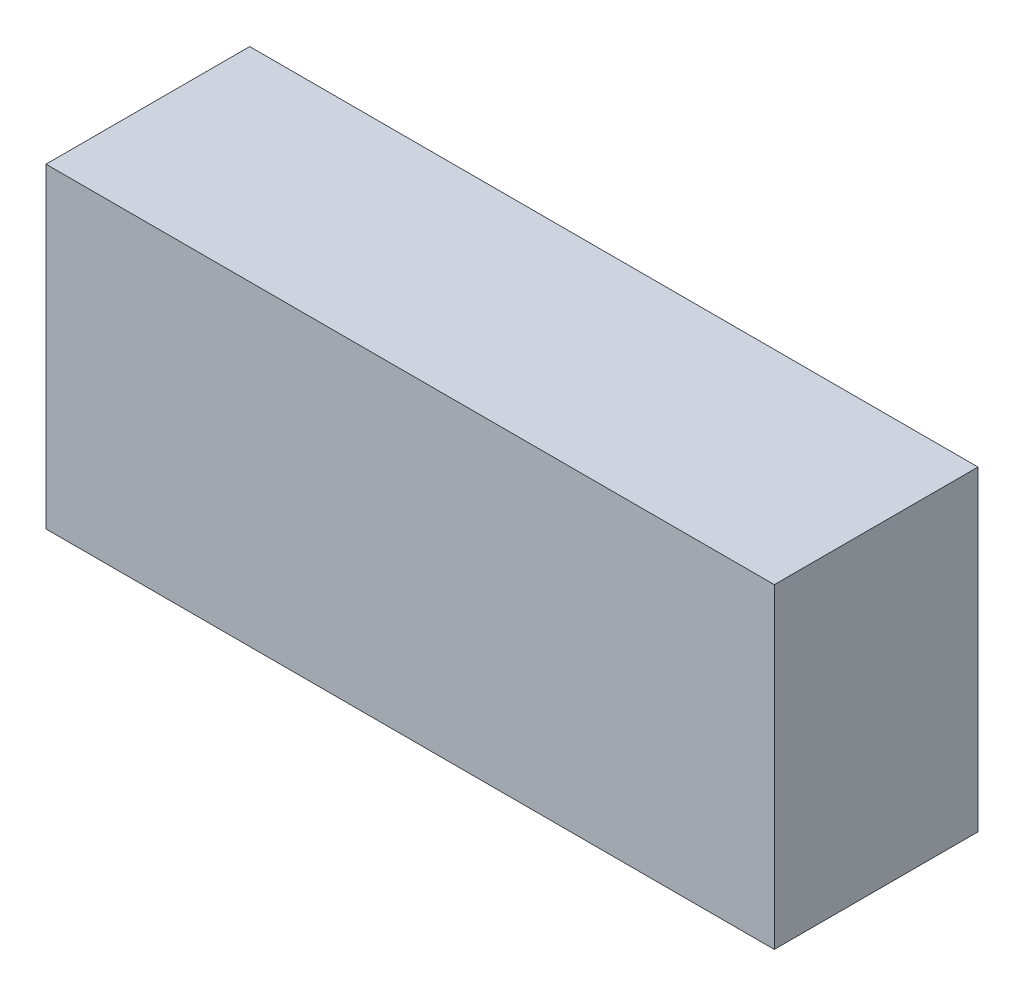
ISO-10303-21;
HEADER;
FILE_DESCRIPTION(('STEP AP214'),'2;1');
FILE_NAME('part.step','',(''),(''),'','','');
FILE_SCHEMA(('AUTOMOTIVE_DESIGN { 1 0 10303 214 1 1 1 1 }'));
ENDSEC;
DATA;
#1=APPLICATION_CONTEXT('core data for automotive mechanical design processes');
#2=APPLICATION_PROTOCOL_DEFINITION('international standard','automotive_design',2000,#1);
#3=PRODUCT_CONTEXT('',#1,'mechanical');
#4=PRODUCT('Part','Part','',(#3));
#5=PRODUCT_RELATED_PRODUCT_CATEGORY('part','',(#4));
#6=PRODUCT_DEFINITION_FORMATION('','',#4);
#7=PRODUCT_DEFINITION_CONTEXT('part definition',#1,'design');
#8=PRODUCT_DEFINITION('design','',#6,#7);
#9=PRODUCT_DEFINITION_SHAPE('','',#8);
#10=(LENGTH_UNIT() NAMED_UNIT(*) SI_UNIT(.MILLI.,.METRE.));
#11=(NAMED_UNIT(*) PLANE_ANGLE_UNIT() SI_UNIT($,.RADIAN.));
#12=(NAMED_UNIT(*) SI_UNIT($,.STERADIAN.) SOLID_ANGLE_UNIT());
#13=UNCERTAINTY_MEASURE_WITH_UNIT(LENGTH_MEASURE(1.E-05),#10,'distance_accuracy_value','');
#14=(GEOMETRIC_REPRESENTATION_CONTEXT(3) GLOBAL_UNCERTAINTY_ASSIGNED_CONTEXT((#13)) GLOBAL_UNIT_ASSIGNED_CONTEXT((#10,
#11,#12)) REPRESENTATION_CONTEXT('',''));
#15=CARTESIAN_POINT('',(0.,0.,0.));
#16=DIRECTION('',(0.,0.,1.));
#17=DIRECTION('',(1.,0.,0.));
#18=AXIS2_PLACEMENT_3D('',#15,#16,#17);
#19=CARTESIAN_POINT('',(43.8,-19.,12.25));
#20=DIRECTION('',(-1.,0.,0.));
#21=DIRECTION('',(0.,0.,1.));
#22=AXIS2_PLACEMENT_3D('',#19,#20,#21);
#23=PLANE('',#22);
#24=DIRECTION('',(0.,1.,0.));
#25=VECTOR('',#24,1.);
#26=CARTESIAN_POINT('',(43.8,-19.,-12.25));
#27=LINE('',#26,#25);
#28=CARTESIAN_POINT('',(43.8,-19.,-12.25));
#29=VERTEX_POINT('',#28);
#30=CARTESIAN_POINT('',(43.8,19.,-12.25));
#31=VERTEX_POINT('',#30);
#32=EDGE_CURVE('E113',#29,#31,#27,.T.);
#33=ORIENTED_EDGE('',*,*,#32,.T.);
#34=DIRECTION('',(0.,0.,-1.));
#35=VECTOR('',#34,1.);
#36=CARTESIAN_POINT('',(43.8,19.,12.25));
#37=LINE('',#36,#35);
#38=CARTESIAN_POINT('',(43.8,19.,12.25));
#39=VERTEX_POINT('',#38);
#40=EDGE_CURVE('E11',#39,#31,#37,.T.);
#41=ORIENTED_EDGE('',*,*,#40,.F.);
#42=DIRECTION('',(0.,1.,0.));
#43=VECTOR('',#42,1.);
#44=CARTESIAN_POINT('',(43.8,-19.,12.25));
#45=LINE('',#44,#43);
#46=CARTESIAN_POINT('',(43.8,-19.,12.25));
#47=VERTEX_POINT('',#46);
#48=EDGE_CURVE('E97',#47,#39,#45,.T.);
#49=ORIENTED_EDGE('',*,*,#48,.F.);
#50=DIRECTION('',(0.,0.,-1.));
#51=VECTOR('',#50,1.);
#52=CARTESIAN_POINT('',(43.8,-19.,12.25));
#53=LINE('',#52,#51);
#54=EDGE_CURVE('E109',#47,#29,#53,.T.);
#55=ORIENTED_EDGE('',*,*,#54,.T.);
#56=EDGE_LOOP('',(#33,#41,#49,#55));
#57=FACE_BOUND('',#56,.T.);
#58=ADVANCED_FACE('F45',(#57),#23,.F.);
#59=CARTESIAN_POINT('',(-43.8,19.,12.25));
#60=DIRECTION('',(0.,-1.,0.));
#61=DIRECTION('',(0.,0.,-1.));
#62=AXIS2_PLACEMENT_3D('',#59,#60,#61);
#63=PLANE('',#62);
#64=DIRECTION('',(-1.,0.,0.));
#65=VECTOR('',#64,1.);
#66=CARTESIAN_POINT('',(-43.8,19.,-12.25));
#67=LINE('',#66,#65);
#68=CARTESIAN_POINT('',(-43.8,19.,-12.25));
#69=VERTEX_POINT('',#68);
#70=EDGE_CURVE('E102',#31,#69,#67,.T.);
#71=ORIENTED_EDGE('',*,*,#70,.T.);
#72=DIRECTION('',(0.,0.,-1.));
#73=VECTOR('',#72,1.);
#74=CARTESIAN_POINT('',(-43.8,19.,12.25));
#75=LINE('',#74,#73);
#76=CARTESIAN_POINT('',(-43.8,19.,12.25));
#77=VERTEX_POINT('',#76);
#78=EDGE_CURVE('E54',#77,#69,#75,.T.);
#79=ORIENTED_EDGE('',*,*,#78,.F.);
#80=DIRECTION('',(-1.,0.,0.));
#81=VECTOR('',#80,1.);
#82=CARTESIAN_POINT('',(-43.8,19.,12.25));
#83=LINE('',#82,#81);
#84=EDGE_CURVE('E92',#39,#77,#83,.T.);
#85=ORIENTED_EDGE('',*,*,#84,.F.);
#86=ORIENTED_EDGE('',*,*,#40,.T.);
#87=EDGE_LOOP('',(#71,#79,#85,#86));
#88=FACE_BOUND('',#87,.T.);
#89=ADVANCED_FACE('F101',(#88),#63,.F.);
#90=CARTESIAN_POINT('',(-43.8,-19.,12.25));
#91=DIRECTION('',(1.,0.,0.));
#92=DIRECTION('',(0.,0.,-1.));
#93=AXIS2_PLACEMENT_3D('',#90,#91,#92);
#94=PLANE('',#93);
#95=DIRECTION('',(0.,-1.,0.));
#96=VECTOR('',#95,1.);
#97=CARTESIAN_POINT('',(-43.8,-19.,-12.25));
#98=LINE('',#97,#96);
#99=CARTESIAN_POINT('',(-43.8,-19.,-12.25));
#100=VERTEX_POINT('',#99);
#101=EDGE_CURVE('E79',#69,#100,#98,.T.);
#102=ORIENTED_EDGE('',*,*,#101,.T.);
#103=DIRECTION('',(0.,0.,-1.));
#104=VECTOR('',#103,1.);
#105=CARTESIAN_POINT('',(-43.8,-19.,12.25));
#106=LINE('',#105,#104);
#107=CARTESIAN_POINT('',(-43.8,-19.,12.25));
#108=VERTEX_POINT('',#107);
#109=EDGE_CURVE('E104',#108,#100,#106,.T.);
#110=ORIENTED_EDGE('',*,*,#109,.F.);
#111=DIRECTION('',(0.,-1.,0.));
#112=VECTOR('',#111,1.);
#113=CARTESIAN_POINT('',(-43.8,-19.,12.25));
#114=LINE('',#113,#112);
#115=EDGE_CURVE('E95',#77,#108,#114,.T.);
#116=ORIENTED_EDGE('',*,*,#115,.F.);
#117=ORIENTED_EDGE('',*,*,#78,.T.);
#118=EDGE_LOOP('',(#102,#110,#116,#117));
#119=FACE_BOUND('',#118,.T.);
#120=ADVANCED_FACE('F105',(#119),#94,.F.);
#121=CARTESIAN_POINT('',(-43.8,-19.,12.25));
#122=DIRECTION('',(0.,1.,0.));
#123=DIRECTION('',(0.,0.,1.));
#124=AXIS2_PLACEMENT_3D('',#121,#122,#123);
#125=PLANE('',#124);
#126=DIRECTION('',(1.,0.,0.));
#127=VECTOR('',#126,1.);
#128=CARTESIAN_POINT('',(-43.8,-19.,-12.25));
#129=LINE('',#128,#127);
#130=EDGE_CURVE('E85',#100,#29,#129,.T.);
#131=ORIENTED_EDGE('',*,*,#130,.T.);
#132=ORIENTED_EDGE('',*,*,#54,.F.);
#133=DIRECTION('',(1.,0.,0.));
#134=VECTOR('',#133,1.);
#135=CARTESIAN_POINT('',(-43.8,-19.,12.25));
#136=LINE('',#135,#134);
#137=EDGE_CURVE('E62',#108,#47,#136,.T.);
#138=ORIENTED_EDGE('',*,*,#137,.F.);
#139=ORIENTED_EDGE('',*,*,#109,.T.);
#140=EDGE_LOOP('',(#131,#132,#138,#139));
#141=FACE_BOUND('',#140,.T.);
#142=ADVANCED_FACE('F126',(#141),#125,.F.);
#143=CARTESIAN_POINT('',(0.,0.,12.25));
#144=DIRECTION('',(0.,0.,-1.));
#145=DIRECTION('',(-1.,0.,0.));
#146=AXIS2_PLACEMENT_3D('',#143,#144,#145);
#147=PLANE('',#146);
#148=ORIENTED_EDGE('',*,*,#48,.T.);
#149=ORIENTED_EDGE('',*,*,#84,.T.);
#150=ORIENTED_EDGE('',*,*,#115,.T.);
#151=ORIENTED_EDGE('',*,*,#137,.T.);
#152=EDGE_LOOP('',(#148,#149,#150,#151));
#153=FACE_BOUND('',#152,.T.);
#154=ADVANCED_FACE('F93',(#153),#147,.F.);
#155=CARTESIAN_POINT('',(0.,0.,-12.25));
#156=DIRECTION('',(0.,0.,-1.));
#157=DIRECTION('',(-1.,0.,0.));
#158=AXIS2_PLACEMENT_3D('',#155,#156,#157);
#159=PLANE('',#158);
#160=ORIENTED_EDGE('',*,*,#32,.F.);
#161=ORIENTED_EDGE('',*,*,#130,.F.);
#162=ORIENTED_EDGE('',*,*,#101,.F.);
#163=ORIENTED_EDGE('',*,*,#70,.F.);
#164=EDGE_LOOP('',(#160,#161,#162,#163));
#165=FACE_BOUND('',#164,.T.);
#166=ADVANCED_FACE('F129',(#165),#159,.T.);
#167=CLOSED_SHELL('',(#58,#89,#120,#142,#154,#166));
#168=MANIFOLD_SOLID_BREP('B2',#167);
#169=ADVANCED_BREP_SHAPE_REPRESENTATION('',(#18,#168),#14);
#170=SHAPE_DEFINITION_REPRESENTATION(#9,#169);
ENDSEC;
END-ISO-10303-21;
